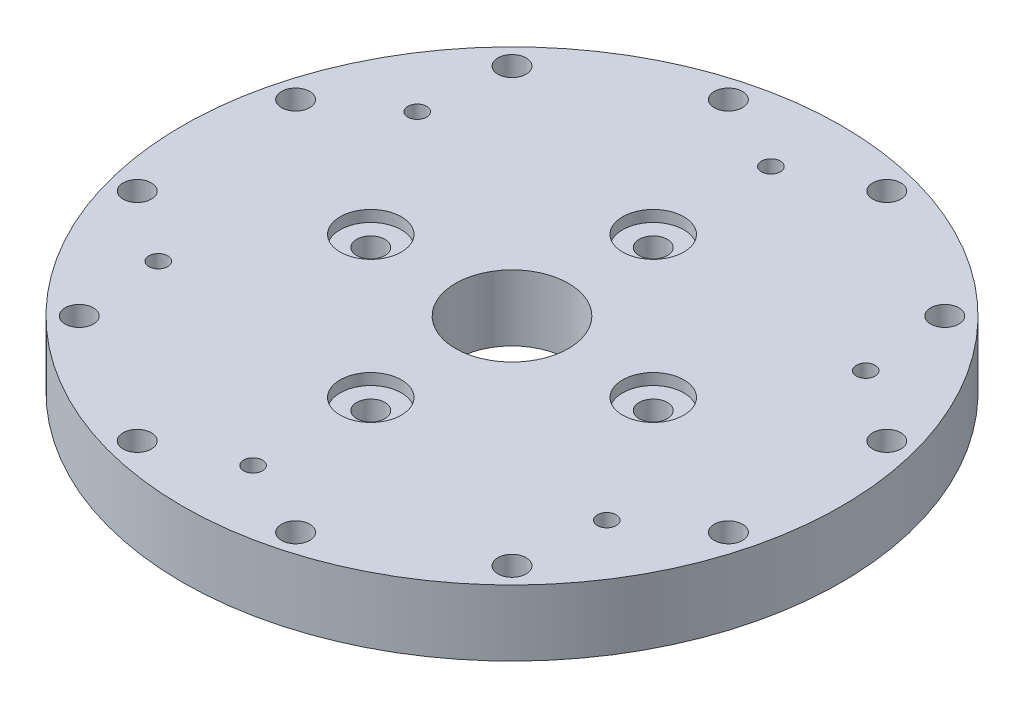
ISO-10303-21;
HEADER;
FILE_DESCRIPTION(('STEP AP214'),'2;1');
FILE_NAME('part.step','',(''),(''),'','','');
FILE_SCHEMA(('AUTOMOTIVE_DESIGN { 1 0 10303 214 1 1 1 1 }'));
ENDSEC;
DATA;
#1=APPLICATION_CONTEXT('core data for automotive mechanical design processes');
#2=APPLICATION_PROTOCOL_DEFINITION('international standard','automotive_design',2000,#1);
#3=PRODUCT_CONTEXT('',#1,'mechanical');
#4=PRODUCT('Part','Part','',(#3));
#5=PRODUCT_RELATED_PRODUCT_CATEGORY('part','',(#4));
#6=PRODUCT_DEFINITION_FORMATION('','',#4);
#7=PRODUCT_DEFINITION_CONTEXT('part definition',#1,'design');
#8=PRODUCT_DEFINITION('design','',#6,#7);
#9=PRODUCT_DEFINITION_SHAPE('','',#8);
#10=(LENGTH_UNIT() NAMED_UNIT(*) SI_UNIT(.MILLI.,.METRE.));
#11=(NAMED_UNIT(*) PLANE_ANGLE_UNIT() SI_UNIT($,.RADIAN.));
#12=(NAMED_UNIT(*) SI_UNIT($,.STERADIAN.) SOLID_ANGLE_UNIT());
#13=UNCERTAINTY_MEASURE_WITH_UNIT(LENGTH_MEASURE(1.E-05),#10,'distance_accuracy_value','');
#14=(GEOMETRIC_REPRESENTATION_CONTEXT(3) GLOBAL_UNCERTAINTY_ASSIGNED_CONTEXT((#13)) GLOBAL_UNIT_ASSIGNED_CONTEXT((#10,
#11,#12)) REPRESENTATION_CONTEXT('',''));
#15=CARTESIAN_POINT('',(0.,0.,0.));
#16=DIRECTION('',(0.,0.,1.));
#17=DIRECTION('',(1.,0.,0.));
#18=AXIS2_PLACEMENT_3D('',#15,#16,#17);
#19=CARTESIAN_POINT('',(0.,7.,-14.9999999999999));
#20=DIRECTION('',(0.,-1.,0.));
#21=DIRECTION('',(0.,0.,-1.));
#22=AXIS2_PLACEMENT_3D('',#19,#20,#21);
#23=CYLINDRICAL_SURFACE('',#22,1.5);
#24=CARTESIAN_POINT('',(0.,0.,-14.9999999999999));
#25=DIRECTION('',(0.,1.,0.));
#26=DIRECTION('',(0.,0.,1.));
#27=AXIS2_PLACEMENT_3D('',#24,#25,#26);
#28=CIRCLE('',#27,1.5);
#29=CARTESIAN_POINT('',(0.,0.,-13.4999999999999));
#30=VERTEX_POINT('',#29);
#31=EDGE_CURVE('E186',#30,#30,#28,.T.);
#32=ORIENTED_EDGE('',*,*,#31,.F.);
#33=EDGE_LOOP('',(#32));
#34=FACE_BOUND('',#33,.T.);
#35=CARTESIAN_POINT('',(0.,5.8,-14.9999999999999));
#36=DIRECTION('',(0.,1.,0.));
#37=DIRECTION('',(0.,0.,1.));
#38=AXIS2_PLACEMENT_3D('',#35,#36,#37);
#39=CIRCLE('',#38,1.5);
#40=CARTESIAN_POINT('',(0.,5.8,-13.4999999999999));
#41=VERTEX_POINT('',#40);
#42=EDGE_CURVE('E37',#41,#41,#39,.T.);
#43=ORIENTED_EDGE('',*,*,#42,.T.);
#44=EDGE_LOOP('',(#43));
#45=FACE_BOUND('',#44,.T.);
#46=ADVANCED_FACE('F33',(#34,#45),#23,.F.);
#47=CARTESIAN_POINT('',(15.0000000000004,7.,-5.21223548286541E-13));
#48=DIRECTION('',(0.,-1.,0.));
#49=DIRECTION('',(0.,0.,-1.));
#50=AXIS2_PLACEMENT_3D('',#47,#48,#49);
#51=CYLINDRICAL_SURFACE('',#50,1.5);
#52=CARTESIAN_POINT('',(15.0000000000004,0.,-5.21223548286541E-13));
#53=DIRECTION('',(0.,1.,0.));
#54=DIRECTION('',(0.,0.,1.));
#55=AXIS2_PLACEMENT_3D('',#52,#53,#54);
#56=CIRCLE('',#55,1.5);
#57=CARTESIAN_POINT('',(15.0000000000004,0.,1.49999999999948));
#58=VERTEX_POINT('',#57);
#59=EDGE_CURVE('E183',#58,#58,#56,.T.);
#60=ORIENTED_EDGE('',*,*,#59,.F.);
#61=EDGE_LOOP('',(#60));
#62=FACE_BOUND('',#61,.T.);
#63=CARTESIAN_POINT('',(15.0000000000004,5.8,-5.21223548286541E-13));
#64=DIRECTION('',(0.,1.,0.));
#65=DIRECTION('',(0.,0.,1.));
#66=AXIS2_PLACEMENT_3D('',#63,#64,#65);
#67=CIRCLE('',#66,1.5);
#68=CARTESIAN_POINT('',(15.0000000000004,5.8,1.49999999999948));
#69=VERTEX_POINT('',#68);
#70=EDGE_CURVE('E58',#69,#69,#67,.T.);
#71=ORIENTED_EDGE('',*,*,#70,.T.);
#72=EDGE_LOOP('',(#71));
#73=FACE_BOUND('',#72,.T.);
#74=ADVANCED_FACE('F212',(#62,#73),#51,.F.);
#75=CARTESIAN_POINT('',(9.84833787313913E-13,7.,14.9999999999999));
#76=DIRECTION('',(0.,-1.,0.));
#77=DIRECTION('',(0.,0.,-1.));
#78=AXIS2_PLACEMENT_3D('',#75,#76,#77);
#79=CYLINDRICAL_SURFACE('',#78,1.5);
#80=CARTESIAN_POINT('',(9.84833787313913E-13,0.,14.9999999999999));
#81=DIRECTION('',(0.,1.,0.));
#82=DIRECTION('',(0.,0.,1.));
#83=AXIS2_PLACEMENT_3D('',#80,#81,#82);
#84=CIRCLE('',#83,1.5);
#85=CARTESIAN_POINT('',(9.84833787313913E-13,0.,16.4999999999999));
#86=VERTEX_POINT('',#85);
#87=EDGE_CURVE('E180',#86,#86,#84,.T.);
#88=ORIENTED_EDGE('',*,*,#87,.F.);
#89=EDGE_LOOP('',(#88));
#90=FACE_BOUND('',#89,.T.);
#91=CARTESIAN_POINT('',(9.84833787313913E-13,5.8,14.9999999999999));
#92=DIRECTION('',(0.,1.,0.));
#93=DIRECTION('',(0.,0.,1.));
#94=AXIS2_PLACEMENT_3D('',#91,#92,#93);
#95=CIRCLE('',#94,1.5);
#96=CARTESIAN_POINT('',(9.84833787313913E-13,5.8,16.4999999999999));
#97=VERTEX_POINT('',#96);
#98=EDGE_CURVE('E55',#97,#97,#95,.T.);
#99=ORIENTED_EDGE('',*,*,#98,.T.);
#100=EDGE_LOOP('',(#99));
#101=FACE_BOUND('',#100,.T.);
#102=ADVANCED_FACE('F217',(#90,#101),#79,.F.);
#103=CARTESIAN_POINT('',(-14.9999999999994,7.,5.23060518485262E-13));
#104=DIRECTION('',(0.,-1.,0.));
#105=DIRECTION('',(0.,0.,-1.));
#106=AXIS2_PLACEMENT_3D('',#103,#104,#105);
#107=CYLINDRICAL_SURFACE('',#106,1.5);
#108=CARTESIAN_POINT('',(-14.9999999999994,0.,5.23060518485262E-13));
#109=DIRECTION('',(0.,1.,0.));
#110=DIRECTION('',(0.,0.,1.));
#111=AXIS2_PLACEMENT_3D('',#108,#109,#110);
#112=CIRCLE('',#111,1.5);
#113=CARTESIAN_POINT('',(-14.9999999999994,0.,1.50000000000052));
#114=VERTEX_POINT('',#113);
#115=EDGE_CURVE('E175',#114,#114,#112,.T.);
#116=ORIENTED_EDGE('',*,*,#115,.F.);
#117=EDGE_LOOP('',(#116));
#118=FACE_BOUND('',#117,.T.);
#119=CARTESIAN_POINT('',(-14.9999999999994,5.8,5.23060518485262E-13));
#120=DIRECTION('',(0.,1.,0.));
#121=DIRECTION('',(0.,0.,1.));
#122=AXIS2_PLACEMENT_3D('',#119,#120,#121);
#123=CIRCLE('',#122,1.5);
#124=CARTESIAN_POINT('',(-14.9999999999994,5.8,1.50000000000052));
#125=VERTEX_POINT('',#124);
#126=EDGE_CURVE('E52',#125,#125,#123,.T.);
#127=ORIENTED_EDGE('',*,*,#126,.T.);
#128=EDGE_LOOP('',(#127));
#129=FACE_BOUND('',#128,.T.);
#130=ADVANCED_FACE('F224',(#118,#129),#107,.F.);
#131=CARTESIAN_POINT('',(0.,7.,0.));
#132=DIRECTION('',(0.,1.,0.));
#133=DIRECTION('',(0.,0.,1.));
#134=AXIS2_PLACEMENT_3D('',#131,#132,#133);
#135=PLANE('',#134);
#136=CARTESIAN_POINT('',(0.,7.,-15.0000000000004));
#137=DIRECTION('',(0.,1.,0.));
#138=DIRECTION('',(0.,0.,1.));
#139=AXIS2_PLACEMENT_3D('',#136,#137,#138);
#140=CIRCLE('',#139,3.25);
#141=CARTESIAN_POINT('',(0.,7.,-11.7500000000004));
#142=VERTEX_POINT('',#141);
#143=EDGE_CURVE('E333',#142,#142,#140,.T.);
#144=ORIENTED_EDGE('',*,*,#143,.F.);
#145=EDGE_LOOP('',(#144));
#146=FACE_BOUND('',#145,.T.);
#147=CARTESIAN_POINT('',(15.0000000000008,7.,-4.23570186157989E-13));
#148=DIRECTION('',(0.,1.,0.));
#149=DIRECTION('',(0.,0.,1.));
#150=AXIS2_PLACEMENT_3D('',#147,#148,#149);
#151=CIRCLE('',#150,3.25);
#152=CARTESIAN_POINT('',(15.0000000000008,7.,3.24999999999958));
#153=VERTEX_POINT('',#152);
#154=EDGE_CURVE('E341',#153,#153,#151,.T.);
#155=ORIENTED_EDGE('',*,*,#154,.F.);
#156=EDGE_LOOP('',(#155));
#157=FACE_BOUND('',#156,.T.);
#158=CARTESIAN_POINT('',(8.47140372315977E-13,7.,15.0000000000004));
#159=DIRECTION('',(0.,1.,0.));
#160=DIRECTION('',(0.,0.,1.));
#161=AXIS2_PLACEMENT_3D('',#158,#159,#160);
#162=CIRCLE('',#161,3.25);
#163=CARTESIAN_POINT('',(8.47140372315977E-13,7.,18.2500000000004));
#164=VERTEX_POINT('',#163);
#165=EDGE_CURVE('E347',#164,#164,#162,.T.);
#166=ORIENTED_EDGE('',*,*,#165,.F.);
#167=EDGE_LOOP('',(#166));
#168=FACE_BOUND('',#167,.T.);
#169=CARTESIAN_POINT('',(-14.9999999999999,7.,4.2540715635671E-13));
#170=DIRECTION('',(0.,1.,0.));
#171=DIRECTION('',(0.,0.,1.));
#172=AXIS2_PLACEMENT_3D('',#169,#170,#171);
#173=CIRCLE('',#172,3.25);
#174=CARTESIAN_POINT('',(-14.9999999999999,7.,3.25000000000043));
#175=VERTEX_POINT('',#174);
#176=EDGE_CURVE('E352',#175,#175,#173,.T.);
#177=ORIENTED_EDGE('',*,*,#176,.F.);
#178=EDGE_LOOP('',(#177));
#179=FACE_BOUND('',#178,.T.);
#180=CARTESIAN_POINT('',(-23.8156986040701,7.,13.7500000000011));
#181=DIRECTION('',(0.,1.,0.));
#182=DIRECTION('',(0.,0.,1.));
#183=AXIS2_PLACEMENT_3D('',#180,#181,#182);
#184=CIRCLE('',#183,1.);
#185=CARTESIAN_POINT('',(-23.8156986040701,7.,14.7500000000011));
#186=VERTEX_POINT('',#185);
#187=EDGE_CURVE('E76',#186,#186,#184,.T.);
#188=ORIENTED_EDGE('',*,*,#187,.F.);
#189=EDGE_LOOP('',(#188));
#190=FACE_BOUND('',#189,.T.);
#191=CARTESIAN_POINT('',(23.815698604074,7.,13.7499999999989));
#192=DIRECTION('',(0.,1.,0.));
#193=DIRECTION('',(0.,0.,1.));
#194=AXIS2_PLACEMENT_3D('',#191,#192,#193);
#195=CIRCLE('',#194,1.);
#196=CARTESIAN_POINT('',(23.815698604074,7.,14.7499999999989));
#197=VERTEX_POINT('',#196);
#198=EDGE_CURVE('E88',#197,#197,#195,.T.);
#199=ORIENTED_EDGE('',*,*,#198,.F.);
#200=EDGE_LOOP('',(#199));
#201=FACE_BOUND('',#200,.T.);
#202=CARTESIAN_POINT('',(-22.9809703885629,7.,22.9809703885627));
#203=DIRECTION('',(0.,1.,0.));
#204=DIRECTION('',(0.,0.,1.));
#205=AXIS2_PLACEMENT_3D('',#202,#203,#204);
#206=CIRCLE('',#205,1.5);
#207=CARTESIAN_POINT('',(-22.9809703885629,7.,24.4809703885627));
#208=VERTEX_POINT('',#207);
#209=EDGE_CURVE('E100',#208,#208,#206,.T.);
#210=ORIENTED_EDGE('',*,*,#209,.F.);
#211=EDGE_LOOP('',(#210));
#212=FACE_BOUND('',#211,.T.);
#213=CARTESIAN_POINT('',(8.41161896583173,7.,31.3925893543948));
#214=DIRECTION('',(0.,1.,0.));
#215=DIRECTION('',(0.,0.,1.));
#216=AXIS2_PLACEMENT_3D('',#213,#214,#215);
#217=CIRCLE('',#216,1.50000000000001);
#218=CARTESIAN_POINT('',(8.41161896583173,7.,32.8925893543948));
#219=VERTEX_POINT('',#218);
#220=EDGE_CURVE('E112',#219,#219,#217,.T.);
#221=ORIENTED_EDGE('',*,*,#220,.F.);
#222=EDGE_LOOP('',(#221));
#223=FACE_BOUND('',#222,.T.);
#224=CARTESIAN_POINT('',(31.3925893543947,7.,8.41161896583212));
#225=DIRECTION('',(0.,1.,0.));
#226=DIRECTION('',(0.,0.,1.));
#227=AXIS2_PLACEMENT_3D('',#224,#225,#226);
#228=CIRCLE('',#227,1.5);
#229=CARTESIAN_POINT('',(31.3925893543947,7.,9.91161896583212));
#230=VERTEX_POINT('',#229);
#231=EDGE_CURVE('E124',#230,#230,#228,.T.);
#232=ORIENTED_EDGE('',*,*,#231,.F.);
#233=EDGE_LOOP('',(#232));
#234=FACE_BOUND('',#233,.T.);
#235=CARTESIAN_POINT('',(22.9809703885629,7.,-22.9809703885627));
#236=DIRECTION('',(0.,1.,0.));
#237=DIRECTION('',(0.,0.,1.));
#238=AXIS2_PLACEMENT_3D('',#235,#236,#237);
#239=CIRCLE('',#238,1.50000000000001);
#240=CARTESIAN_POINT('',(22.9809703885629,7.,-21.4809703885626));
#241=VERTEX_POINT('',#240);
#242=EDGE_CURVE('E136',#241,#241,#239,.T.);
#243=ORIENTED_EDGE('',*,*,#242,.F.);
#244=EDGE_LOOP('',(#243));
#245=FACE_BOUND('',#244,.T.);
#246=CARTESIAN_POINT('',(-8.41161896583172,7.,-31.3925893543948));
#247=DIRECTION('',(0.,1.,0.));
#248=DIRECTION('',(0.,0.,1.));
#249=AXIS2_PLACEMENT_3D('',#246,#247,#248);
#250=CIRCLE('',#249,1.50000000000001);
#251=CARTESIAN_POINT('',(-8.41161896583172,7.,-29.8925893543948));
#252=VERTEX_POINT('',#251);
#253=EDGE_CURVE('E148',#252,#252,#250,.T.);
#254=ORIENTED_EDGE('',*,*,#253,.F.);
#255=EDGE_LOOP('',(#254));
#256=FACE_BOUND('',#255,.T.);
#257=CARTESIAN_POINT('',(-31.3925893543947,7.,-8.41161896583212));
#258=DIRECTION('',(0.,1.,0.));
#259=DIRECTION('',(0.,0.,1.));
#260=AXIS2_PLACEMENT_3D('',#257,#258,#259);
#261=CIRCLE('',#260,1.50000000000001);
#262=CARTESIAN_POINT('',(-31.3925893543947,7.,-6.91161896583211));
#263=VERTEX_POINT('',#262);
#264=EDGE_CURVE('E160',#263,#263,#261,.T.);
#265=ORIENTED_EDGE('',*,*,#264,.F.);
#266=EDGE_LOOP('',(#265));
#267=FACE_BOUND('',#266,.T.);
#268=CARTESIAN_POINT('',(-31.3925893543948,7.,8.41161896583172));
#269=DIRECTION('',(0.,1.,0.));
#270=DIRECTION('',(0.,0.,1.));
#271=AXIS2_PLACEMENT_3D('',#268,#269,#270);
#272=CIRCLE('',#271,1.5);
#273=CARTESIAN_POINT('',(-31.3925893543948,7.,9.91161896583173));
#274=VERTEX_POINT('',#273);
#275=EDGE_CURVE('E172',#274,#274,#272,.T.);
#276=ORIENTED_EDGE('',*,*,#275,.F.);
#277=EDGE_LOOP('',(#276));
#278=FACE_BOUND('',#277,.T.);
#279=CARTESIAN_POINT('',(0.,7.,0.));
#280=DIRECTION('',(0.,1.,0.));
#281=DIRECTION('',(0.,0.,1.));
#282=AXIS2_PLACEMENT_3D('',#279,#280,#281);
#283=CIRCLE('',#282,35.);
#284=CARTESIAN_POINT('',(0.,7.,35.));
#285=VERTEX_POINT('',#284);
#286=EDGE_CURVE('E10',#285,#285,#283,.T.);
#287=ORIENTED_EDGE('',*,*,#286,.T.);
#288=EDGE_LOOP('',(#287));
#289=FACE_BOUND('',#288,.T.);
#290=CARTESIAN_POINT('',(0.,7.,0.));
#291=DIRECTION('',(0.,1.,0.));
#292=DIRECTION('',(0.,0.,1.));
#293=AXIS2_PLACEMENT_3D('',#290,#291,#292);
#294=CIRCLE('',#293,6.);
#295=CARTESIAN_POINT('',(0.,7.,6.));
#296=VERTEX_POINT('',#295);
#297=EDGE_CURVE('E46',#296,#296,#294,.T.);
#298=ORIENTED_EDGE('',*,*,#297,.F.);
#299=EDGE_LOOP('',(#298));
#300=FACE_BOUND('',#299,.T.);
#301=CARTESIAN_POINT('',(0.,7.,-27.5));
#302=DIRECTION('',(0.,1.,0.));
#303=DIRECTION('',(0.,0.,1.));
#304=AXIS2_PLACEMENT_3D('',#301,#302,#303);
#305=CIRCLE('',#304,1.);
#306=CARTESIAN_POINT('',(0.,7.,-26.5));
#307=VERTEX_POINT('',#306);
#308=EDGE_CURVE('E166',#307,#307,#305,.T.);
#309=ORIENTED_EDGE('',*,*,#308,.F.);
#310=EDGE_LOOP('',(#309));
#311=FACE_BOUND('',#310,.T.);
#312=CARTESIAN_POINT('',(-22.9809703885626,7.,-22.9809703885629));
#313=DIRECTION('',(0.,1.,0.));
#314=DIRECTION('',(0.,0.,1.));
#315=AXIS2_PLACEMENT_3D('',#312,#313,#314);
#316=CIRCLE('',#315,1.5);
#317=CARTESIAN_POINT('',(-22.9809703885626,7.,-21.4809703885629));
#318=VERTEX_POINT('',#317);
#319=EDGE_CURVE('E154',#318,#318,#316,.T.);
#320=ORIENTED_EDGE('',*,*,#319,.F.);
#321=EDGE_LOOP('',(#320));
#322=FACE_BOUND('',#321,.T.);
#323=CARTESIAN_POINT('',(8.41161896583212,7.,-31.3925893543947));
#324=DIRECTION('',(0.,1.,0.));
#325=DIRECTION('',(0.,0.,1.));
#326=AXIS2_PLACEMENT_3D('',#323,#324,#325);
#327=CIRCLE('',#326,1.5);
#328=CARTESIAN_POINT('',(8.41161896583212,7.,-29.8925893543947));
#329=VERTEX_POINT('',#328);
#330=EDGE_CURVE('E142',#329,#329,#327,.T.);
#331=ORIENTED_EDGE('',*,*,#330,.F.);
#332=EDGE_LOOP('',(#331));
#333=FACE_BOUND('',#332,.T.);
#334=CARTESIAN_POINT('',(31.3925893543948,7.,-8.41161896583172));
#335=DIRECTION('',(0.,1.,0.));
#336=DIRECTION('',(0.,0.,1.));
#337=AXIS2_PLACEMENT_3D('',#334,#335,#336);
#338=CIRCLE('',#337,1.5);
#339=CARTESIAN_POINT('',(31.3925893543948,7.,-6.91161896583172));
#340=VERTEX_POINT('',#339);
#341=EDGE_CURVE('E130',#340,#340,#338,.T.);
#342=ORIENTED_EDGE('',*,*,#341,.F.);
#343=EDGE_LOOP('',(#342));
#344=FACE_BOUND('',#343,.T.);
#345=CARTESIAN_POINT('',(22.9809703885627,7.,22.9809703885629));
#346=DIRECTION('',(0.,1.,0.));
#347=DIRECTION('',(0.,0.,1.));
#348=AXIS2_PLACEMENT_3D('',#345,#346,#347);
#349=CIRCLE('',#348,1.5);
#350=CARTESIAN_POINT('',(22.9809703885627,7.,24.4809703885629));
#351=VERTEX_POINT('',#350);
#352=EDGE_CURVE('E118',#351,#351,#349,.T.);
#353=ORIENTED_EDGE('',*,*,#352,.F.);
#354=EDGE_LOOP('',(#353));
#355=FACE_BOUND('',#354,.T.);
#356=CARTESIAN_POINT('',(-8.4116189658321,7.,31.3925893543947));
#357=DIRECTION('',(0.,1.,0.));
#358=DIRECTION('',(0.,0.,1.));
#359=AXIS2_PLACEMENT_3D('',#356,#357,#358);
#360=CIRCLE('',#359,1.5);
#361=CARTESIAN_POINT('',(-8.4116189658321,7.,32.8925893543947));
#362=VERTEX_POINT('',#361);
#363=EDGE_CURVE('E106',#362,#362,#360,.T.);
#364=ORIENTED_EDGE('',*,*,#363,.F.);
#365=EDGE_LOOP('',(#364));
#366=FACE_BOUND('',#365,.T.);
#367=CARTESIAN_POINT('',(23.8156986040727,7.,-13.7500000000011));
#368=DIRECTION('',(0.,1.,0.));
#369=DIRECTION('',(0.,0.,1.));
#370=AXIS2_PLACEMENT_3D('',#367,#368,#369);
#371=CIRCLE('',#370,1.);
#372=CARTESIAN_POINT('',(23.8156986040727,7.,-12.7500000000011));
#373=VERTEX_POINT('',#372);
#374=EDGE_CURVE('E94',#373,#373,#371,.T.);
#375=ORIENTED_EDGE('',*,*,#374,.F.);
#376=EDGE_LOOP('',(#375));
#377=FACE_BOUND('',#376,.T.);
#378=CARTESIAN_POINT('',(2.54662586584425E-12,7.,27.5));
#379=DIRECTION('',(0.,1.,0.));
#380=DIRECTION('',(0.,0.,1.));
#381=AXIS2_PLACEMENT_3D('',#378,#379,#380);
#382=CIRCLE('',#381,1.);
#383=CARTESIAN_POINT('',(2.54662586584425E-12,7.,28.5));
#384=VERTEX_POINT('',#383);
#385=EDGE_CURVE('E82',#384,#384,#382,.T.);
#386=ORIENTED_EDGE('',*,*,#385,.F.);
#387=EDGE_LOOP('',(#386));
#388=FACE_BOUND('',#387,.T.);
#389=CARTESIAN_POINT('',(-23.8156986040714,7.,-13.7499999999989));
#390=DIRECTION('',(0.,1.,0.));
#391=DIRECTION('',(0.,0.,1.));
#392=AXIS2_PLACEMENT_3D('',#389,#390,#391);
#393=CIRCLE('',#392,1.);
#394=CARTESIAN_POINT('',(-23.8156986040714,7.,-12.7499999999989));
#395=VERTEX_POINT('',#394);
#396=EDGE_CURVE('E67',#395,#395,#393,.T.);
#397=ORIENTED_EDGE('',*,*,#396,.F.);
#398=EDGE_LOOP('',(#397));
#399=FACE_BOUND('',#398,.T.);
#400=ADVANCED_FACE('F227',(#146,#157,#168,#179,#190,#201,#212,#223,#234,#245,#256,#267,#278,
#289,#300,#311,#322,#333,#344,#355,#366,#377,#388,#399),#135,.T.);
#401=CARTESIAN_POINT('',(0.,0.,0.));
#402=DIRECTION('',(0.,1.,0.));
#403=DIRECTION('',(0.,0.,1.));
#404=AXIS2_PLACEMENT_3D('',#401,#402,#403);
#405=PLANE('',#404);
#406=CARTESIAN_POINT('',(0.,0.,0.));
#407=DIRECTION('',(0.,1.,0.));
#408=DIRECTION('',(0.,0.,1.));
#409=AXIS2_PLACEMENT_3D('',#406,#407,#408);
#410=CIRCLE('',#409,35.);
#411=CARTESIAN_POINT('',(0.,0.,35.));
#412=VERTEX_POINT('',#411);
#413=EDGE_CURVE('E41',#412,#412,#410,.T.);
#414=ORIENTED_EDGE('',*,*,#413,.F.);
#415=EDGE_LOOP('',(#414));
#416=FACE_BOUND('',#415,.T.);
#417=CARTESIAN_POINT('',(0.,0.,0.));
#418=DIRECTION('',(0.,1.,0.));
#419=DIRECTION('',(0.,0.,1.));
#420=AXIS2_PLACEMENT_3D('',#417,#418,#419);
#421=CIRCLE('',#420,6.);
#422=CARTESIAN_POINT('',(0.,0.,6.));
#423=VERTEX_POINT('',#422);
#424=EDGE_CURVE('E49',#423,#423,#421,.T.);
#425=ORIENTED_EDGE('',*,*,#424,.T.);
#426=EDGE_LOOP('',(#425));
#427=FACE_BOUND('',#426,.T.);
#428=ORIENTED_EDGE('',*,*,#31,.T.);
#429=EDGE_LOOP('',(#428));
#430=FACE_BOUND('',#429,.T.);
#431=ORIENTED_EDGE('',*,*,#59,.T.);
#432=EDGE_LOOP('',(#431));
#433=FACE_BOUND('',#432,.T.);
#434=ORIENTED_EDGE('',*,*,#87,.T.);
#435=EDGE_LOOP('',(#434));
#436=FACE_BOUND('',#435,.T.);
#437=ORIENTED_EDGE('',*,*,#115,.T.);
#438=EDGE_LOOP('',(#437));
#439=FACE_BOUND('',#438,.T.);
#440=CARTESIAN_POINT('',(-31.3925893543948,0.,8.41161896583172));
#441=DIRECTION('',(0.,1.,0.));
#442=DIRECTION('',(0.,0.,1.));
#443=AXIS2_PLACEMENT_3D('',#440,#441,#442);
#444=CIRCLE('',#443,1.5);
#445=CARTESIAN_POINT('',(-31.3925893543948,0.,9.91161896583173));
#446=VERTEX_POINT('',#445);
#447=EDGE_CURVE('E169',#446,#446,#444,.T.);
#448=ORIENTED_EDGE('',*,*,#447,.T.);
#449=EDGE_LOOP('',(#448));
#450=FACE_BOUND('',#449,.T.);
#451=CARTESIAN_POINT('',(0.,0.,-27.5));
#452=DIRECTION('',(0.,1.,0.));
#453=DIRECTION('',(0.,0.,1.));
#454=AXIS2_PLACEMENT_3D('',#451,#452,#453);
#455=CIRCLE('',#454,1.);
#456=CARTESIAN_POINT('',(0.,0.,-26.5));
#457=VERTEX_POINT('',#456);
#458=EDGE_CURVE('E163',#457,#457,#455,.T.);
#459=ORIENTED_EDGE('',*,*,#458,.T.);
#460=EDGE_LOOP('',(#459));
#461=FACE_BOUND('',#460,.T.);
#462=CARTESIAN_POINT('',(-31.3925893543947,0.,-8.41161896583212));
#463=DIRECTION('',(0.,1.,0.));
#464=DIRECTION('',(0.,0.,1.));
#465=AXIS2_PLACEMENT_3D('',#462,#463,#464);
#466=CIRCLE('',#465,1.50000000000001);
#467=CARTESIAN_POINT('',(-31.3925893543947,0.,-6.91161896583211));
#468=VERTEX_POINT('',#467);
#469=EDGE_CURVE('E157',#468,#468,#466,.T.);
#470=ORIENTED_EDGE('',*,*,#469,.T.);
#471=EDGE_LOOP('',(#470));
#472=FACE_BOUND('',#471,.T.);
#473=CARTESIAN_POINT('',(-22.9809703885626,0.,-22.9809703885629));
#474=DIRECTION('',(0.,1.,0.));
#475=DIRECTION('',(0.,0.,1.));
#476=AXIS2_PLACEMENT_3D('',#473,#474,#475);
#477=CIRCLE('',#476,1.5);
#478=CARTESIAN_POINT('',(-22.9809703885626,0.,-21.4809703885629));
#479=VERTEX_POINT('',#478);
#480=EDGE_CURVE('E151',#479,#479,#477,.T.);
#481=ORIENTED_EDGE('',*,*,#480,.T.);
#482=EDGE_LOOP('',(#481));
#483=FACE_BOUND('',#482,.T.);
#484=CARTESIAN_POINT('',(-8.41161896583172,0.,-31.3925893543948));
#485=DIRECTION('',(0.,1.,0.));
#486=DIRECTION('',(0.,0.,1.));
#487=AXIS2_PLACEMENT_3D('',#484,#485,#486);
#488=CIRCLE('',#487,1.50000000000001);
#489=CARTESIAN_POINT('',(-8.41161896583172,0.,-29.8925893543948));
#490=VERTEX_POINT('',#489);
#491=EDGE_CURVE('E145',#490,#490,#488,.T.);
#492=ORIENTED_EDGE('',*,*,#491,.T.);
#493=EDGE_LOOP('',(#492));
#494=FACE_BOUND('',#493,.T.);
#495=CARTESIAN_POINT('',(8.41161896583212,0.,-31.3925893543947));
#496=DIRECTION('',(0.,1.,0.));
#497=DIRECTION('',(0.,0.,1.));
#498=AXIS2_PLACEMENT_3D('',#495,#496,#497);
#499=CIRCLE('',#498,1.5);
#500=CARTESIAN_POINT('',(8.41161896583212,0.,-29.8925893543947));
#501=VERTEX_POINT('',#500);
#502=EDGE_CURVE('E139',#501,#501,#499,.T.);
#503=ORIENTED_EDGE('',*,*,#502,.T.);
#504=EDGE_LOOP('',(#503));
#505=FACE_BOUND('',#504,.T.);
#506=CARTESIAN_POINT('',(22.9809703885629,0.,-22.9809703885627));
#507=DIRECTION('',(0.,1.,0.));
#508=DIRECTION('',(0.,0.,1.));
#509=AXIS2_PLACEMENT_3D('',#506,#507,#508);
#510=CIRCLE('',#509,1.50000000000001);
#511=CARTESIAN_POINT('',(22.9809703885629,0.,-21.4809703885626));
#512=VERTEX_POINT('',#511);
#513=EDGE_CURVE('E133',#512,#512,#510,.T.);
#514=ORIENTED_EDGE('',*,*,#513,.T.);
#515=EDGE_LOOP('',(#514));
#516=FACE_BOUND('',#515,.T.);
#517=CARTESIAN_POINT('',(31.3925893543948,0.,-8.41161896583172));
#518=DIRECTION('',(0.,1.,0.));
#519=DIRECTION('',(0.,0.,1.));
#520=AXIS2_PLACEMENT_3D('',#517,#518,#519);
#521=CIRCLE('',#520,1.5);
#522=CARTESIAN_POINT('',(31.3925893543948,0.,-6.91161896583172));
#523=VERTEX_POINT('',#522);
#524=EDGE_CURVE('E127',#523,#523,#521,.T.);
#525=ORIENTED_EDGE('',*,*,#524,.T.);
#526=EDGE_LOOP('',(#525));
#527=FACE_BOUND('',#526,.T.);
#528=CARTESIAN_POINT('',(31.3925893543947,0.,8.41161896583212));
#529=DIRECTION('',(0.,1.,0.));
#530=DIRECTION('',(0.,0.,1.));
#531=AXIS2_PLACEMENT_3D('',#528,#529,#530);
#532=CIRCLE('',#531,1.5);
#533=CARTESIAN_POINT('',(31.3925893543947,0.,9.91161896583212));
#534=VERTEX_POINT('',#533);
#535=EDGE_CURVE('E121',#534,#534,#532,.T.);
#536=ORIENTED_EDGE('',*,*,#535,.T.);
#537=EDGE_LOOP('',(#536));
#538=FACE_BOUND('',#537,.T.);
#539=CARTESIAN_POINT('',(22.9809703885627,0.,22.9809703885629));
#540=DIRECTION('',(0.,1.,0.));
#541=DIRECTION('',(0.,0.,1.));
#542=AXIS2_PLACEMENT_3D('',#539,#540,#541);
#543=CIRCLE('',#542,1.5);
#544=CARTESIAN_POINT('',(22.9809703885627,0.,24.4809703885629));
#545=VERTEX_POINT('',#544);
#546=EDGE_CURVE('E115',#545,#545,#543,.T.);
#547=ORIENTED_EDGE('',*,*,#546,.T.);
#548=EDGE_LOOP('',(#547));
#549=FACE_BOUND('',#548,.T.);
#550=CARTESIAN_POINT('',(8.41161896583173,0.,31.3925893543948));
#551=DIRECTION('',(0.,1.,0.));
#552=DIRECTION('',(0.,0.,1.));
#553=AXIS2_PLACEMENT_3D('',#550,#551,#552);
#554=CIRCLE('',#553,1.50000000000001);
#555=CARTESIAN_POINT('',(8.41161896583173,0.,32.8925893543948));
#556=VERTEX_POINT('',#555);
#557=EDGE_CURVE('E109',#556,#556,#554,.T.);
#558=ORIENTED_EDGE('',*,*,#557,.T.);
#559=EDGE_LOOP('',(#558));
#560=FACE_BOUND('',#559,.T.);
#561=CARTESIAN_POINT('',(-8.4116189658321,0.,31.3925893543947));
#562=DIRECTION('',(0.,1.,0.));
#563=DIRECTION('',(0.,0.,1.));
#564=AXIS2_PLACEMENT_3D('',#561,#562,#563);
#565=CIRCLE('',#564,1.5);
#566=CARTESIAN_POINT('',(-8.4116189658321,0.,32.8925893543947));
#567=VERTEX_POINT('',#566);
#568=EDGE_CURVE('E103',#567,#567,#565,.T.);
#569=ORIENTED_EDGE('',*,*,#568,.T.);
#570=EDGE_LOOP('',(#569));
#571=FACE_BOUND('',#570,.T.);
#572=CARTESIAN_POINT('',(-22.9809703885629,0.,22.9809703885627));
#573=DIRECTION('',(0.,1.,0.));
#574=DIRECTION('',(0.,0.,1.));
#575=AXIS2_PLACEMENT_3D('',#572,#573,#574);
#576=CIRCLE('',#575,1.5);
#577=CARTESIAN_POINT('',(-22.9809703885629,0.,24.4809703885627));
#578=VERTEX_POINT('',#577);
#579=EDGE_CURVE('E97',#578,#578,#576,.T.);
#580=ORIENTED_EDGE('',*,*,#579,.T.);
#581=EDGE_LOOP('',(#580));
#582=FACE_BOUND('',#581,.T.);
#583=CARTESIAN_POINT('',(23.8156986040727,0.,-13.7500000000011));
#584=DIRECTION('',(0.,1.,0.));
#585=DIRECTION('',(0.,0.,1.));
#586=AXIS2_PLACEMENT_3D('',#583,#584,#585);
#587=CIRCLE('',#586,1.);
#588=CARTESIAN_POINT('',(23.8156986040727,0.,-12.7500000000011));
#589=VERTEX_POINT('',#588);
#590=EDGE_CURVE('E91',#589,#589,#587,.T.);
#591=ORIENTED_EDGE('',*,*,#590,.T.);
#592=EDGE_LOOP('',(#591));
#593=FACE_BOUND('',#592,.T.);
#594=CARTESIAN_POINT('',(23.815698604074,0.,13.7499999999989));
#595=DIRECTION('',(0.,1.,0.));
#596=DIRECTION('',(0.,0.,1.));
#597=AXIS2_PLACEMENT_3D('',#594,#595,#596);
#598=CIRCLE('',#597,1.);
#599=CARTESIAN_POINT('',(23.815698604074,0.,14.7499999999989));
#600=VERTEX_POINT('',#599);
#601=EDGE_CURVE('E85',#600,#600,#598,.T.);
#602=ORIENTED_EDGE('',*,*,#601,.T.);
#603=EDGE_LOOP('',(#602));
#604=FACE_BOUND('',#603,.T.);
#605=CARTESIAN_POINT('',(2.54662586584425E-12,0.,27.5));
#606=DIRECTION('',(0.,1.,0.));
#607=DIRECTION('',(0.,0.,1.));
#608=AXIS2_PLACEMENT_3D('',#605,#606,#607);
#609=CIRCLE('',#608,1.);
#610=CARTESIAN_POINT('',(2.54662586584425E-12,0.,28.5));
#611=VERTEX_POINT('',#610);
#612=EDGE_CURVE('E79',#611,#611,#609,.T.);
#613=ORIENTED_EDGE('',*,*,#612,.T.);
#614=EDGE_LOOP('',(#613));
#615=FACE_BOUND('',#614,.T.);
#616=CARTESIAN_POINT('',(-23.8156986040701,0.,13.7500000000011));
#617=DIRECTION('',(0.,1.,0.));
#618=DIRECTION('',(0.,0.,1.));
#619=AXIS2_PLACEMENT_3D('',#616,#617,#618);
#620=CIRCLE('',#619,1.);
#621=CARTESIAN_POINT('',(-23.8156986040701,0.,14.7500000000011));
#622=VERTEX_POINT('',#621);
#623=EDGE_CURVE('E72',#622,#622,#620,.T.);
#624=ORIENTED_EDGE('',*,*,#623,.T.);
#625=EDGE_LOOP('',(#624));
#626=FACE_BOUND('',#625,.T.);
#627=CARTESIAN_POINT('',(-23.8156986040714,0.,-13.7499999999989));
#628=DIRECTION('',(0.,1.,0.));
#629=DIRECTION('',(0.,0.,1.));
#630=AXIS2_PLACEMENT_3D('',#627,#628,#629);
#631=CIRCLE('',#630,1.);
#632=CARTESIAN_POINT('',(-23.8156986040714,0.,-12.7499999999989));
#633=VERTEX_POINT('',#632);
#634=EDGE_CURVE('E63',#633,#633,#631,.T.);
#635=ORIENTED_EDGE('',*,*,#634,.T.);
#636=EDGE_LOOP('',(#635));
#637=FACE_BOUND('',#636,.T.);
#638=ADVANCED_FACE('F194',(#416,#427,#430,#433,#436,#439,#450,#461,#472,#483,#494,#505,#516,
#527,#538,#549,#560,#571,#582,#593,#604,#615,#626,#637),#405,.F.);
#639=CARTESIAN_POINT('',(0.,7.,0.));
#640=DIRECTION('',(0.,-1.,0.));
#641=DIRECTION('',(0.,0.,-1.));
#642=AXIS2_PLACEMENT_3D('',#639,#640,#641);
#643=CYLINDRICAL_SURFACE('',#642,35.);
#644=ORIENTED_EDGE('',*,*,#286,.F.);
#645=EDGE_LOOP('',(#644));
#646=FACE_BOUND('',#645,.T.);
#647=ORIENTED_EDGE('',*,*,#413,.T.);
#648=EDGE_LOOP('',(#647));
#649=FACE_BOUND('',#648,.T.);
#650=ADVANCED_FACE('F35',(#646,#649),#643,.T.);
#651=CARTESIAN_POINT('',(0.,7.,0.));
#652=DIRECTION('',(0.,-1.,0.));
#653=DIRECTION('',(0.,0.,-1.));
#654=AXIS2_PLACEMENT_3D('',#651,#652,#653);
#655=CYLINDRICAL_SURFACE('',#654,6.);
#656=ORIENTED_EDGE('',*,*,#297,.T.);
#657=EDGE_LOOP('',(#656));
#658=FACE_BOUND('',#657,.T.);
#659=ORIENTED_EDGE('',*,*,#424,.F.);
#660=EDGE_LOOP('',(#659));
#661=FACE_BOUND('',#660,.T.);
#662=ADVANCED_FACE('F197',(#658,#661),#655,.F.);
#663=CARTESIAN_POINT('',(-31.3925893543948,7.,8.41161896583172));
#664=DIRECTION('',(0.,-1.,0.));
#665=DIRECTION('',(0.,0.,-1.));
#666=AXIS2_PLACEMENT_3D('',#663,#664,#665);
#667=CYLINDRICAL_SURFACE('',#666,1.5);
#668=ORIENTED_EDGE('',*,*,#275,.T.);
#669=EDGE_LOOP('',(#668));
#670=FACE_BOUND('',#669,.T.);
#671=ORIENTED_EDGE('',*,*,#447,.F.);
#672=EDGE_LOOP('',(#671));
#673=FACE_BOUND('',#672,.T.);
#674=ADVANCED_FACE('F199',(#670,#673),#667,.F.);
#675=CARTESIAN_POINT('',(0.,7.,-27.5));
#676=DIRECTION('',(0.,-1.,0.));
#677=DIRECTION('',(0.,0.,-1.));
#678=AXIS2_PLACEMENT_3D('',#675,#676,#677);
#679=CYLINDRICAL_SURFACE('',#678,1.);
#680=ORIENTED_EDGE('',*,*,#308,.T.);
#681=EDGE_LOOP('',(#680));
#682=FACE_BOUND('',#681,.T.);
#683=ORIENTED_EDGE('',*,*,#458,.F.);
#684=EDGE_LOOP('',(#683));
#685=FACE_BOUND('',#684,.T.);
#686=ADVANCED_FACE('F205',(#682,#685),#679,.F.);
#687=CARTESIAN_POINT('',(-31.3925893543947,7.,-8.41161896583212));
#688=DIRECTION('',(0.,-1.,0.));
#689=DIRECTION('',(0.,0.,-1.));
#690=AXIS2_PLACEMENT_3D('',#687,#688,#689);
#691=CYLINDRICAL_SURFACE('',#690,1.50000000000001);
#692=ORIENTED_EDGE('',*,*,#264,.T.);
#693=EDGE_LOOP('',(#692));
#694=FACE_BOUND('',#693,.T.);
#695=ORIENTED_EDGE('',*,*,#469,.F.);
#696=EDGE_LOOP('',(#695));
#697=FACE_BOUND('',#696,.T.);
#698=ADVANCED_FACE('F232',(#694,#697),#691,.F.);
#699=CARTESIAN_POINT('',(-22.9809703885626,7.,-22.9809703885629));
#700=DIRECTION('',(0.,-1.,0.));
#701=DIRECTION('',(0.,0.,-1.));
#702=AXIS2_PLACEMENT_3D('',#699,#700,#701);
#703=CYLINDRICAL_SURFACE('',#702,1.5);
#704=ORIENTED_EDGE('',*,*,#319,.T.);
#705=EDGE_LOOP('',(#704));
#706=FACE_BOUND('',#705,.T.);
#707=ORIENTED_EDGE('',*,*,#480,.F.);
#708=EDGE_LOOP('',(#707));
#709=FACE_BOUND('',#708,.T.);
#710=ADVANCED_FACE('F236',(#706,#709),#703,.F.);
#711=CARTESIAN_POINT('',(-8.41161896583172,7.,-31.3925893543948));
#712=DIRECTION('',(0.,-1.,0.));
#713=DIRECTION('',(0.,0.,-1.));
#714=AXIS2_PLACEMENT_3D('',#711,#712,#713);
#715=CYLINDRICAL_SURFACE('',#714,1.50000000000001);
#716=ORIENTED_EDGE('',*,*,#253,.T.);
#717=EDGE_LOOP('',(#716));
#718=FACE_BOUND('',#717,.T.);
#719=ORIENTED_EDGE('',*,*,#491,.F.);
#720=EDGE_LOOP('',(#719));
#721=FACE_BOUND('',#720,.T.);
#722=ADVANCED_FACE('F240',(#718,#721),#715,.F.);
#723=CARTESIAN_POINT('',(8.41161896583212,7.,-31.3925893543947));
#724=DIRECTION('',(0.,-1.,0.));
#725=DIRECTION('',(0.,0.,-1.));
#726=AXIS2_PLACEMENT_3D('',#723,#724,#725);
#727=CYLINDRICAL_SURFACE('',#726,1.5);
#728=ORIENTED_EDGE('',*,*,#330,.T.);
#729=EDGE_LOOP('',(#728));
#730=FACE_BOUND('',#729,.T.);
#731=ORIENTED_EDGE('',*,*,#502,.F.);
#732=EDGE_LOOP('',(#731));
#733=FACE_BOUND('',#732,.T.);
#734=ADVANCED_FACE('F244',(#730,#733),#727,.F.);
#735=CARTESIAN_POINT('',(22.9809703885629,7.,-22.9809703885627));
#736=DIRECTION('',(0.,-1.,0.));
#737=DIRECTION('',(0.,0.,-1.));
#738=AXIS2_PLACEMENT_3D('',#735,#736,#737);
#739=CYLINDRICAL_SURFACE('',#738,1.50000000000001);
#740=ORIENTED_EDGE('',*,*,#242,.T.);
#741=EDGE_LOOP('',(#740));
#742=FACE_BOUND('',#741,.T.);
#743=ORIENTED_EDGE('',*,*,#513,.F.);
#744=EDGE_LOOP('',(#743));
#745=FACE_BOUND('',#744,.T.);
#746=ADVANCED_FACE('F248',(#742,#745),#739,.F.);
#747=CARTESIAN_POINT('',(31.3925893543948,7.,-8.41161896583172));
#748=DIRECTION('',(0.,-1.,0.));
#749=DIRECTION('',(0.,0.,-1.));
#750=AXIS2_PLACEMENT_3D('',#747,#748,#749);
#751=CYLINDRICAL_SURFACE('',#750,1.5);
#752=ORIENTED_EDGE('',*,*,#341,.T.);
#753=EDGE_LOOP('',(#752));
#754=FACE_BOUND('',#753,.T.);
#755=ORIENTED_EDGE('',*,*,#524,.F.);
#756=EDGE_LOOP('',(#755));
#757=FACE_BOUND('',#756,.T.);
#758=ADVANCED_FACE('F252',(#754,#757),#751,.F.);
#759=CARTESIAN_POINT('',(31.3925893543947,7.,8.41161896583212));
#760=DIRECTION('',(0.,-1.,0.));
#761=DIRECTION('',(0.,0.,-1.));
#762=AXIS2_PLACEMENT_3D('',#759,#760,#761);
#763=CYLINDRICAL_SURFACE('',#762,1.5);
#764=ORIENTED_EDGE('',*,*,#231,.T.);
#765=EDGE_LOOP('',(#764));
#766=FACE_BOUND('',#765,.T.);
#767=ORIENTED_EDGE('',*,*,#535,.F.);
#768=EDGE_LOOP('',(#767));
#769=FACE_BOUND('',#768,.T.);
#770=ADVANCED_FACE('F256',(#766,#769),#763,.F.);
#771=CARTESIAN_POINT('',(22.9809703885627,7.,22.9809703885629));
#772=DIRECTION('',(0.,-1.,0.));
#773=DIRECTION('',(0.,0.,-1.));
#774=AXIS2_PLACEMENT_3D('',#771,#772,#773);
#775=CYLINDRICAL_SURFACE('',#774,1.5);
#776=ORIENTED_EDGE('',*,*,#352,.T.);
#777=EDGE_LOOP('',(#776));
#778=FACE_BOUND('',#777,.T.);
#779=ORIENTED_EDGE('',*,*,#546,.F.);
#780=EDGE_LOOP('',(#779));
#781=FACE_BOUND('',#780,.T.);
#782=ADVANCED_FACE('F260',(#778,#781),#775,.F.);
#783=CARTESIAN_POINT('',(8.41161896583173,7.,31.3925893543948));
#784=DIRECTION('',(0.,-1.,0.));
#785=DIRECTION('',(0.,0.,-1.));
#786=AXIS2_PLACEMENT_3D('',#783,#784,#785);
#787=CYLINDRICAL_SURFACE('',#786,1.50000000000001);
#788=ORIENTED_EDGE('',*,*,#220,.T.);
#789=EDGE_LOOP('',(#788));
#790=FACE_BOUND('',#789,.T.);
#791=ORIENTED_EDGE('',*,*,#557,.F.);
#792=EDGE_LOOP('',(#791));
#793=FACE_BOUND('',#792,.T.);
#794=ADVANCED_FACE('F264',(#790,#793),#787,.F.);
#795=CARTESIAN_POINT('',(-8.4116189658321,7.,31.3925893543947));
#796=DIRECTION('',(0.,-1.,0.));
#797=DIRECTION('',(0.,0.,-1.));
#798=AXIS2_PLACEMENT_3D('',#795,#796,#797);
#799=CYLINDRICAL_SURFACE('',#798,1.5);
#800=ORIENTED_EDGE('',*,*,#363,.T.);
#801=EDGE_LOOP('',(#800));
#802=FACE_BOUND('',#801,.T.);
#803=ORIENTED_EDGE('',*,*,#568,.F.);
#804=EDGE_LOOP('',(#803));
#805=FACE_BOUND('',#804,.T.);
#806=ADVANCED_FACE('F268',(#802,#805),#799,.F.);
#807=CARTESIAN_POINT('',(-22.9809703885629,7.,22.9809703885627));
#808=DIRECTION('',(0.,-1.,0.));
#809=DIRECTION('',(0.,0.,-1.));
#810=AXIS2_PLACEMENT_3D('',#807,#808,#809);
#811=CYLINDRICAL_SURFACE('',#810,1.5);
#812=ORIENTED_EDGE('',*,*,#209,.T.);
#813=EDGE_LOOP('',(#812));
#814=FACE_BOUND('',#813,.T.);
#815=ORIENTED_EDGE('',*,*,#579,.F.);
#816=EDGE_LOOP('',(#815));
#817=FACE_BOUND('',#816,.T.);
#818=ADVANCED_FACE('F272',(#814,#817),#811,.F.);
#819=CARTESIAN_POINT('',(23.8156986040727,7.,-13.7500000000011));
#820=DIRECTION('',(0.,-1.,0.));
#821=DIRECTION('',(0.,0.,-1.));
#822=AXIS2_PLACEMENT_3D('',#819,#820,#821);
#823=CYLINDRICAL_SURFACE('',#822,1.);
#824=ORIENTED_EDGE('',*,*,#374,.T.);
#825=EDGE_LOOP('',(#824));
#826=FACE_BOUND('',#825,.T.);
#827=ORIENTED_EDGE('',*,*,#590,.F.);
#828=EDGE_LOOP('',(#827));
#829=FACE_BOUND('',#828,.T.);
#830=ADVANCED_FACE('F276',(#826,#829),#823,.F.);
#831=CARTESIAN_POINT('',(23.815698604074,7.,13.7499999999989));
#832=DIRECTION('',(0.,-1.,0.));
#833=DIRECTION('',(0.,0.,-1.));
#834=AXIS2_PLACEMENT_3D('',#831,#832,#833);
#835=CYLINDRICAL_SURFACE('',#834,1.);
#836=ORIENTED_EDGE('',*,*,#198,.T.);
#837=EDGE_LOOP('',(#836));
#838=FACE_BOUND('',#837,.T.);
#839=ORIENTED_EDGE('',*,*,#601,.F.);
#840=EDGE_LOOP('',(#839));
#841=FACE_BOUND('',#840,.T.);
#842=ADVANCED_FACE('F280',(#838,#841),#835,.F.);
#843=CARTESIAN_POINT('',(2.54662586584425E-12,7.,27.5));
#844=DIRECTION('',(0.,-1.,0.));
#845=DIRECTION('',(0.,0.,-1.));
#846=AXIS2_PLACEMENT_3D('',#843,#844,#845);
#847=CYLINDRICAL_SURFACE('',#846,1.);
#848=ORIENTED_EDGE('',*,*,#385,.T.);
#849=EDGE_LOOP('',(#848));
#850=FACE_BOUND('',#849,.T.);
#851=ORIENTED_EDGE('',*,*,#612,.F.);
#852=EDGE_LOOP('',(#851));
#853=FACE_BOUND('',#852,.T.);
#854=ADVANCED_FACE('F284',(#850,#853),#847,.F.);
#855=CARTESIAN_POINT('',(-23.8156986040701,7.,13.7500000000011));
#856=DIRECTION('',(0.,-1.,0.));
#857=DIRECTION('',(0.,0.,-1.));
#858=AXIS2_PLACEMENT_3D('',#855,#856,#857);
#859=CYLINDRICAL_SURFACE('',#858,1.);
#860=ORIENTED_EDGE('',*,*,#187,.T.);
#861=EDGE_LOOP('',(#860));
#862=FACE_BOUND('',#861,.T.);
#863=ORIENTED_EDGE('',*,*,#623,.F.);
#864=EDGE_LOOP('',(#863));
#865=FACE_BOUND('',#864,.T.);
#866=ADVANCED_FACE('F288',(#862,#865),#859,.F.);
#867=CARTESIAN_POINT('',(-23.8156986040714,7.,-13.7499999999989));
#868=DIRECTION('',(0.,-1.,0.));
#869=DIRECTION('',(0.,0.,-1.));
#870=AXIS2_PLACEMENT_3D('',#867,#868,#869);
#871=CYLINDRICAL_SURFACE('',#870,1.);
#872=ORIENTED_EDGE('',*,*,#396,.T.);
#873=EDGE_LOOP('',(#872));
#874=FACE_BOUND('',#873,.T.);
#875=ORIENTED_EDGE('',*,*,#634,.F.);
#876=EDGE_LOOP('',(#875));
#877=FACE_BOUND('',#876,.T.);
#878=ADVANCED_FACE('F292',(#874,#877),#871,.F.);
#879=CARTESIAN_POINT('',(-14.9999999999999,5.8,4.2540715635671E-13));
#880=DIRECTION('',(0.,1.,0.));
#881=DIRECTION('',(0.,0.,1.));
#882=AXIS2_PLACEMENT_3D('',#879,#880,#881);
#883=CYLINDRICAL_SURFACE('',#882,3.25);
#884=CARTESIAN_POINT('',(-14.9999999999999,5.8,4.2540715635671E-13));
#885=DIRECTION('',(0.,1.,0.));
#886=DIRECTION('',(0.,0.,1.));
#887=AXIS2_PLACEMENT_3D('',#884,#885,#886);
#888=CIRCLE('',#887,3.25);
#889=CARTESIAN_POINT('',(-14.9999999999999,5.8,3.25000000000043));
#890=VERTEX_POINT('',#889);
#891=EDGE_CURVE('E350',#890,#890,#888,.T.);
#892=ORIENTED_EDGE('',*,*,#891,.F.);
#893=EDGE_LOOP('',(#892));
#894=FACE_BOUND('',#893,.T.);
#895=ORIENTED_EDGE('',*,*,#176,.T.);
#896=EDGE_LOOP('',(#895));
#897=FACE_BOUND('',#896,.T.);
#898=ADVANCED_FACE('F296',(#894,#897),#883,.F.);
#899=CARTESIAN_POINT('',(-14.9999999999999,5.8,4.2540715635671E-13));
#900=DIRECTION('',(0.,1.,0.));
#901=DIRECTION('',(0.,0.,1.));
#902=AXIS2_PLACEMENT_3D('',#899,#900,#901);
#903=PLANE('',#902);
#904=ORIENTED_EDGE('',*,*,#126,.F.);
#905=EDGE_LOOP('',(#904));
#906=FACE_BOUND('',#905,.T.);
#907=ORIENTED_EDGE('',*,*,#891,.T.);
#908=EDGE_LOOP('',(#907));
#909=FACE_BOUND('',#908,.T.);
#910=ADVANCED_FACE('F300',(#906,#909),#903,.T.);
#911=CARTESIAN_POINT('',(8.47140372315977E-13,5.8,15.0000000000004));
#912=DIRECTION('',(0.,1.,0.));
#913=DIRECTION('',(0.,0.,1.));
#914=AXIS2_PLACEMENT_3D('',#911,#912,#913);
#915=CYLINDRICAL_SURFACE('',#914,3.25);
#916=CARTESIAN_POINT('',(8.47140372315977E-13,5.8,15.0000000000004));
#917=DIRECTION('',(0.,1.,0.));
#918=DIRECTION('',(0.,0.,1.));
#919=AXIS2_PLACEMENT_3D('',#916,#917,#918);
#920=CIRCLE('',#919,3.25);
#921=CARTESIAN_POINT('',(8.47140372315977E-13,5.8,18.2500000000004));
#922=VERTEX_POINT('',#921);
#923=EDGE_CURVE('E344',#922,#922,#920,.T.);
#924=ORIENTED_EDGE('',*,*,#923,.F.);
#925=EDGE_LOOP('',(#924));
#926=FACE_BOUND('',#925,.T.);
#927=ORIENTED_EDGE('',*,*,#165,.T.);
#928=EDGE_LOOP('',(#927));
#929=FACE_BOUND('',#928,.T.);
#930=ADVANCED_FACE('F304',(#926,#929),#915,.F.);
#931=CARTESIAN_POINT('',(8.47140372315977E-13,5.8,15.0000000000004));
#932=DIRECTION('',(0.,1.,0.));
#933=DIRECTION('',(0.,0.,1.));
#934=AXIS2_PLACEMENT_3D('',#931,#932,#933);
#935=PLANE('',#934);
#936=ORIENTED_EDGE('',*,*,#98,.F.);
#937=EDGE_LOOP('',(#936));
#938=FACE_BOUND('',#937,.T.);
#939=ORIENTED_EDGE('',*,*,#923,.T.);
#940=EDGE_LOOP('',(#939));
#941=FACE_BOUND('',#940,.T.);
#942=ADVANCED_FACE('F308',(#938,#941),#935,.T.);
#943=CARTESIAN_POINT('',(15.0000000000008,5.8,-4.23570186157989E-13));
#944=DIRECTION('',(0.,1.,0.));
#945=DIRECTION('',(0.,0.,1.));
#946=AXIS2_PLACEMENT_3D('',#943,#944,#945);
#947=CYLINDRICAL_SURFACE('',#946,3.25);
#948=CARTESIAN_POINT('',(15.0000000000008,5.8,-4.23570186157989E-13));
#949=DIRECTION('',(0.,1.,0.));
#950=DIRECTION('',(0.,0.,1.));
#951=AXIS2_PLACEMENT_3D('',#948,#949,#950);
#952=CIRCLE('',#951,3.25);
#953=CARTESIAN_POINT('',(15.0000000000008,5.8,3.24999999999958));
#954=VERTEX_POINT('',#953);
#955=EDGE_CURVE('E336',#954,#954,#952,.T.);
#956=ORIENTED_EDGE('',*,*,#955,.F.);
#957=EDGE_LOOP('',(#956));
#958=FACE_BOUND('',#957,.T.);
#959=ORIENTED_EDGE('',*,*,#154,.T.);
#960=EDGE_LOOP('',(#959));
#961=FACE_BOUND('',#960,.T.);
#962=ADVANCED_FACE('F312',(#958,#961),#947,.F.);
#963=CARTESIAN_POINT('',(15.0000000000008,5.8,-4.23570186157989E-13));
#964=DIRECTION('',(0.,1.,0.));
#965=DIRECTION('',(0.,0.,1.));
#966=AXIS2_PLACEMENT_3D('',#963,#964,#965);
#967=PLANE('',#966);
#968=ORIENTED_EDGE('',*,*,#70,.F.);
#969=EDGE_LOOP('',(#968));
#970=FACE_BOUND('',#969,.T.);
#971=ORIENTED_EDGE('',*,*,#955,.T.);
#972=EDGE_LOOP('',(#971));
#973=FACE_BOUND('',#972,.T.);
#974=ADVANCED_FACE('F316',(#970,#973),#967,.T.);
#975=CARTESIAN_POINT('',(0.,5.8,-15.0000000000004));
#976=DIRECTION('',(0.,1.,0.));
#977=DIRECTION('',(0.,0.,1.));
#978=AXIS2_PLACEMENT_3D('',#975,#976,#977);
#979=CYLINDRICAL_SURFACE('',#978,3.25);
#980=CARTESIAN_POINT('',(0.,5.8,-15.0000000000004));
#981=DIRECTION('',(0.,1.,0.));
#982=DIRECTION('',(0.,0.,1.));
#983=AXIS2_PLACEMENT_3D('',#980,#981,#982);
#984=CIRCLE('',#983,3.25);
#985=CARTESIAN_POINT('',(0.,5.8,-11.7500000000004));
#986=VERTEX_POINT('',#985);
#987=EDGE_CURVE('E56',#986,#986,#984,.T.);
#988=ORIENTED_EDGE('',*,*,#987,.F.);
#989=EDGE_LOOP('',(#988));
#990=FACE_BOUND('',#989,.T.);
#991=ORIENTED_EDGE('',*,*,#143,.T.);
#992=EDGE_LOOP('',(#991));
#993=FACE_BOUND('',#992,.T.);
#994=ADVANCED_FACE('F320',(#990,#993),#979,.F.);
#995=CARTESIAN_POINT('',(0.,5.8,-15.0000000000004));
#996=DIRECTION('',(0.,1.,0.));
#997=DIRECTION('',(0.,0.,1.));
#998=AXIS2_PLACEMENT_3D('',#995,#996,#997);
#999=PLANE('',#998);
#1000=ORIENTED_EDGE('',*,*,#42,.F.);
#1001=EDGE_LOOP('',(#1000));
#1002=FACE_BOUND('',#1001,.T.);
#1003=ORIENTED_EDGE('',*,*,#987,.T.);
#1004=EDGE_LOOP('',(#1003));
#1005=FACE_BOUND('',#1004,.T.);
#1006=ADVANCED_FACE('F324',(#1002,#1005),#999,.T.);
#1007=CLOSED_SHELL('',(#46,#74,#102,#130,#400,#638,#650,#662,#674,#686,#698,#710,#722,#734,#746,
#758,#770,#782,#794,#806,#818,#830,#842,#854,#866,#878,#898,#910,#930,#942,#962,#974,#994,#1006));
#1008=MANIFOLD_SOLID_BREP('B2',#1007);
#1009=ADVANCED_BREP_SHAPE_REPRESENTATION('',(#18,#1008),#14);
#1010=SHAPE_DEFINITION_REPRESENTATION(#9,#1009);
ENDSEC;
END-ISO-10303-21;
